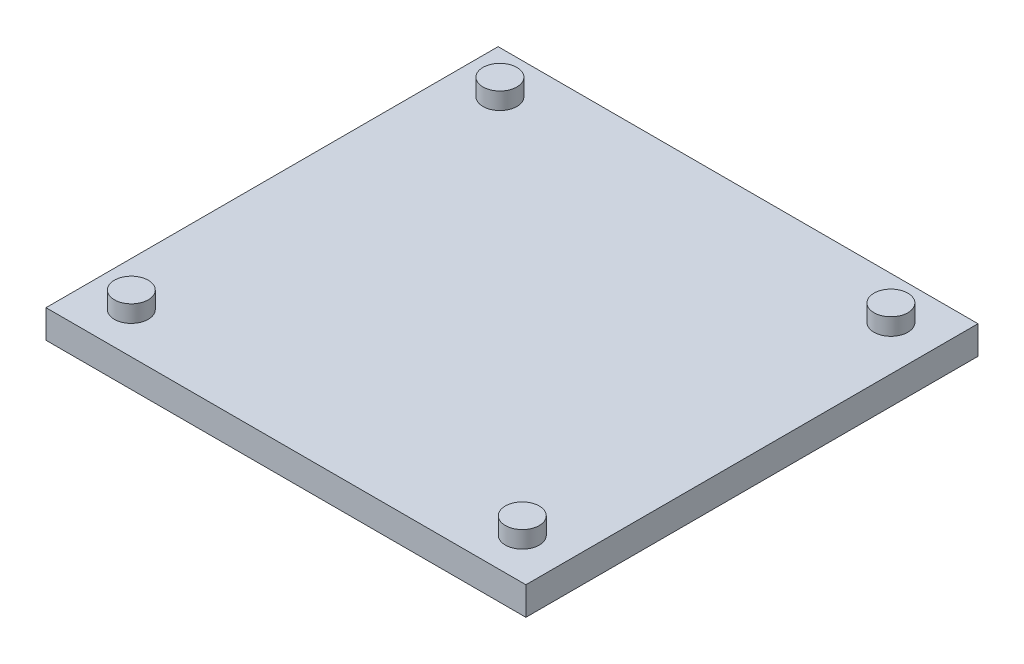
ISO-10303-21;
HEADER;
FILE_DESCRIPTION(('STEP AP214'),'2;1');
FILE_NAME('part.step','',(''),(''),'','','');
FILE_SCHEMA(('AUTOMOTIVE_DESIGN { 1 0 10303 214 1 1 1 1 }'));
ENDSEC;
DATA;
#1=APPLICATION_CONTEXT('core data for automotive mechanical design processes');
#2=APPLICATION_PROTOCOL_DEFINITION('international standard','automotive_design',2000,#1);
#3=PRODUCT_CONTEXT('',#1,'mechanical');
#4=PRODUCT('Part','Part','',(#3));
#5=PRODUCT_RELATED_PRODUCT_CATEGORY('part','',(#4));
#6=PRODUCT_DEFINITION_FORMATION('','',#4);
#7=PRODUCT_DEFINITION_CONTEXT('part definition',#1,'design');
#8=PRODUCT_DEFINITION('design','',#6,#7);
#9=PRODUCT_DEFINITION_SHAPE('','',#8);
#10=(LENGTH_UNIT() NAMED_UNIT(*) SI_UNIT(.MILLI.,.METRE.));
#11=(NAMED_UNIT(*) PLANE_ANGLE_UNIT() SI_UNIT($,.RADIAN.));
#12=(NAMED_UNIT(*) SI_UNIT($,.STERADIAN.) SOLID_ANGLE_UNIT());
#13=UNCERTAINTY_MEASURE_WITH_UNIT(LENGTH_MEASURE(1.E-05),#10,'distance_accuracy_value','');
#14=(GEOMETRIC_REPRESENTATION_CONTEXT(3) GLOBAL_UNCERTAINTY_ASSIGNED_CONTEXT((#13)) GLOBAL_UNIT_ASSIGNED_CONTEXT((#10,
#11,#12)) REPRESENTATION_CONTEXT('',''));
#15=CARTESIAN_POINT('',(0.,0.,0.));
#16=DIRECTION('',(0.,0.,1.));
#17=DIRECTION('',(1.,0.,0.));
#18=AXIS2_PLACEMENT_3D('',#15,#16,#17);
#19=CARTESIAN_POINT('',(0.,5.,0.));
#20=DIRECTION('',(0.,-1.,0.));
#21=DIRECTION('',(0.,0.,-1.));
#22=AXIS2_PLACEMENT_3D('',#19,#20,#21);
#23=PLANE('',#22);
#24=DIRECTION('',(-1.,0.,0.));
#25=VECTOR('',#24,1.);
#26=CARTESIAN_POINT('',(-44.4257114828403,5.,18.1171209400979));
#27=LINE('',#26,#25);
#28=CARTESIAN_POINT('',(40.4907436482127,5.,18.1171209400979));
#29=VERTEX_POINT('',#28);
#30=CARTESIAN_POINT('',(-44.4257114828403,5.,18.1171209400979));
#31=VERTEX_POINT('',#30);
#32=EDGE_CURVE('E91',#29,#31,#27,.T.);
#33=ORIENTED_EDGE('',*,*,#32,.T.);
#34=DIRECTION('',(0.,0.,1.));
#35=VECTOR('',#34,1.);
#36=CARTESIAN_POINT('',(-44.4257114828403,5.,18.1171209400979));
#37=LINE('',#36,#35);
#38=CARTESIAN_POINT('',(-44.4257114828403,5.,98.1171209400979));
#39=VERTEX_POINT('',#38);
#40=EDGE_CURVE('E86',#31,#39,#37,.T.);
#41=ORIENTED_EDGE('',*,*,#40,.T.);
#42=DIRECTION('',(1.,0.,0.));
#43=VECTOR('',#42,1.);
#44=CARTESIAN_POINT('',(-44.4257114828403,5.,98.1171209400979));
#45=LINE('',#44,#43);
#46=CARTESIAN_POINT('',(40.4907436482127,5.,98.1171209400979));
#47=VERTEX_POINT('',#46);
#48=EDGE_CURVE('E89',#39,#47,#45,.T.);
#49=ORIENTED_EDGE('',*,*,#48,.T.);
#50=DIRECTION('',(0.,0.,-1.));
#51=VECTOR('',#50,1.);
#52=CARTESIAN_POINT('',(40.4907436482127,5.,18.1171209400979));
#53=LINE('',#52,#51);
#54=EDGE_CURVE('E56',#47,#29,#53,.T.);
#55=ORIENTED_EDGE('',*,*,#54,.T.);
#56=EDGE_LOOP('',(#33,#41,#49,#55));
#57=FACE_BOUND('',#56,.T.);
#58=CARTESIAN_POINT('',(-36.5850717066579,5.,25.6363490732059));
#59=DIRECTION('',(0.,1.,0.));
#60=DIRECTION('',(0.,0.,1.));
#61=AXIS2_PLACEMENT_3D('',#58,#59,#60);
#62=CIRCLE('',#61,3.00000000000001);
#63=CARTESIAN_POINT('',(-36.5850717066579,5.,28.6363490732059));
#64=VERTEX_POINT('',#63);
#65=EDGE_CURVE('E106',#64,#64,#62,.T.);
#66=ORIENTED_EDGE('',*,*,#65,.F.);
#67=EDGE_LOOP('',(#66));
#68=FACE_BOUND('',#67,.T.);
#69=CARTESIAN_POINT('',(32.6016130829819,5.,25.6363490732059));
#70=DIRECTION('',(0.,1.,0.));
#71=DIRECTION('',(0.,0.,1.));
#72=AXIS2_PLACEMENT_3D('',#69,#70,#71);
#73=CIRCLE('',#72,3.);
#74=CARTESIAN_POINT('',(32.6016130829819,5.,28.6363490732059));
#75=VERTEX_POINT('',#74);
#76=EDGE_CURVE('E119',#75,#75,#73,.T.);
#77=ORIENTED_EDGE('',*,*,#76,.F.);
#78=EDGE_LOOP('',(#77));
#79=FACE_BOUND('',#78,.T.);
#80=CARTESIAN_POINT('',(-36.5850717066579,5.,90.8619641229808));
#81=DIRECTION('',(0.,1.,0.));
#82=DIRECTION('',(0.,0.,1.));
#83=AXIS2_PLACEMENT_3D('',#80,#81,#82);
#84=CIRCLE('',#83,3.00000000000001);
#85=CARTESIAN_POINT('',(-36.5850717066579,5.,93.8619641229808));
#86=VERTEX_POINT('',#85);
#87=EDGE_CURVE('E122',#86,#86,#84,.T.);
#88=ORIENTED_EDGE('',*,*,#87,.F.);
#89=EDGE_LOOP('',(#88));
#90=FACE_BOUND('',#89,.T.);
#91=CARTESIAN_POINT('',(32.6016130829819,5.,90.8619641229808));
#92=DIRECTION('',(0.,1.,0.));
#93=DIRECTION('',(0.,0.,1.));
#94=AXIS2_PLACEMENT_3D('',#91,#92,#93);
#95=CIRCLE('',#94,3.00000000000001);
#96=CARTESIAN_POINT('',(32.6016130829819,5.,93.8619641229808));
#97=VERTEX_POINT('',#96);
#98=EDGE_CURVE('E125',#97,#97,#95,.T.);
#99=ORIENTED_EDGE('',*,*,#98,.F.);
#100=EDGE_LOOP('',(#99));
#101=FACE_BOUND('',#100,.T.);
#102=ADVANCED_FACE('F39',(#57,#68,#79,#90,#101),#23,.F.);
#103=CARTESIAN_POINT('',(0.,0.,0.));
#104=DIRECTION('',(0.,-1.,0.));
#105=DIRECTION('',(0.,0.,-1.));
#106=AXIS2_PLACEMENT_3D('',#103,#104,#105);
#107=PLANE('',#106);
#108=DIRECTION('',(-1.,0.,0.));
#109=VECTOR('',#108,1.);
#110=CARTESIAN_POINT('',(-44.4257114828403,0.,18.1171209400979));
#111=LINE('',#110,#109);
#112=CARTESIAN_POINT('',(40.4907436482127,0.,18.1171209400979));
#113=VERTEX_POINT('',#112);
#114=CARTESIAN_POINT('',(-44.4257114828403,0.,18.1171209400979));
#115=VERTEX_POINT('',#114);
#116=EDGE_CURVE('E103',#113,#115,#111,.T.);
#117=ORIENTED_EDGE('',*,*,#116,.F.);
#118=DIRECTION('',(0.,0.,-1.));
#119=VECTOR('',#118,1.);
#120=CARTESIAN_POINT('',(40.4907436482127,0.,18.1171209400979));
#121=LINE('',#120,#119);
#122=CARTESIAN_POINT('',(40.4907436482127,0.,98.1171209400979));
#123=VERTEX_POINT('',#122);
#124=EDGE_CURVE('E79',#123,#113,#121,.T.);
#125=ORIENTED_EDGE('',*,*,#124,.F.);
#126=DIRECTION('',(1.,0.,0.));
#127=VECTOR('',#126,1.);
#128=CARTESIAN_POINT('',(-44.4257114828403,0.,98.1171209400979));
#129=LINE('',#128,#127);
#130=CARTESIAN_POINT('',(-44.4257114828403,0.,98.1171209400979));
#131=VERTEX_POINT('',#130);
#132=EDGE_CURVE('E73',#131,#123,#129,.T.);
#133=ORIENTED_EDGE('',*,*,#132,.F.);
#134=DIRECTION('',(0.,0.,1.));
#135=VECTOR('',#134,1.);
#136=CARTESIAN_POINT('',(-44.4257114828403,0.,18.1171209400979));
#137=LINE('',#136,#135);
#138=EDGE_CURVE('E95',#115,#131,#137,.T.);
#139=ORIENTED_EDGE('',*,*,#138,.F.);
#140=EDGE_LOOP('',(#117,#125,#133,#139));
#141=FACE_BOUND('',#140,.T.);
#142=ADVANCED_FACE('F114',(#141),#107,.T.);
#143=CARTESIAN_POINT('',(-44.4257114828403,5.,18.1171209400979));
#144=DIRECTION('',(0.,0.,1.));
#145=DIRECTION('',(1.,0.,0.));
#146=AXIS2_PLACEMENT_3D('',#143,#144,#145);
#147=PLANE('',#146);
#148=ORIENTED_EDGE('',*,*,#116,.T.);
#149=DIRECTION('',(0.,-1.,0.));
#150=VECTOR('',#149,1.);
#151=CARTESIAN_POINT('',(-44.4257114828403,5.,18.1171209400979));
#152=LINE('',#151,#150);
#153=EDGE_CURVE('E11',#31,#115,#152,.T.);
#154=ORIENTED_EDGE('',*,*,#153,.F.);
#155=ORIENTED_EDGE('',*,*,#32,.F.);
#156=DIRECTION('',(0.,-1.,0.));
#157=VECTOR('',#156,1.);
#158=CARTESIAN_POINT('',(40.4907436482127,5.,18.1171209400979));
#159=LINE('',#158,#157);
#160=EDGE_CURVE('E99',#29,#113,#159,.T.);
#161=ORIENTED_EDGE('',*,*,#160,.T.);
#162=EDGE_LOOP('',(#148,#154,#155,#161));
#163=FACE_BOUND('',#162,.T.);
#164=ADVANCED_FACE('F41',(#163),#147,.F.);
#165=CARTESIAN_POINT('',(-44.4257114828403,5.,18.1171209400979));
#166=DIRECTION('',(1.,0.,0.));
#167=DIRECTION('',(0.,0.,-1.));
#168=AXIS2_PLACEMENT_3D('',#165,#166,#167);
#169=PLANE('',#168);
#170=ORIENTED_EDGE('',*,*,#138,.T.);
#171=DIRECTION('',(0.,-1.,0.));
#172=VECTOR('',#171,1.);
#173=CARTESIAN_POINT('',(-44.4257114828403,5.,98.1171209400979));
#174=LINE('',#173,#172);
#175=EDGE_CURVE('E48',#39,#131,#174,.T.);
#176=ORIENTED_EDGE('',*,*,#175,.F.);
#177=ORIENTED_EDGE('',*,*,#40,.F.);
#178=ORIENTED_EDGE('',*,*,#153,.T.);
#179=EDGE_LOOP('',(#170,#176,#177,#178));
#180=FACE_BOUND('',#179,.T.);
#181=ADVANCED_FACE('F94',(#180),#169,.F.);
#182=CARTESIAN_POINT('',(-44.4257114828403,5.,98.1171209400979));
#183=DIRECTION('',(0.,0.,-1.));
#184=DIRECTION('',(-1.,0.,0.));
#185=AXIS2_PLACEMENT_3D('',#182,#183,#184);
#186=PLANE('',#185);
#187=ORIENTED_EDGE('',*,*,#132,.T.);
#188=DIRECTION('',(0.,-1.,0.));
#189=VECTOR('',#188,1.);
#190=CARTESIAN_POINT('',(40.4907436482127,5.,98.1171209400979));
#191=LINE('',#190,#189);
#192=EDGE_CURVE('E96',#47,#123,#191,.T.);
#193=ORIENTED_EDGE('',*,*,#192,.F.);
#194=ORIENTED_EDGE('',*,*,#48,.F.);
#195=ORIENTED_EDGE('',*,*,#175,.T.);
#196=EDGE_LOOP('',(#187,#193,#194,#195));
#197=FACE_BOUND('',#196,.T.);
#198=ADVANCED_FACE('F97',(#197),#186,.F.);
#199=CARTESIAN_POINT('',(40.4907436482127,5.,18.1171209400979));
#200=DIRECTION('',(-1.,0.,0.));
#201=DIRECTION('',(0.,0.,1.));
#202=AXIS2_PLACEMENT_3D('',#199,#200,#201);
#203=PLANE('',#202);
#204=ORIENTED_EDGE('',*,*,#124,.T.);
#205=ORIENTED_EDGE('',*,*,#160,.F.);
#206=ORIENTED_EDGE('',*,*,#54,.F.);
#207=ORIENTED_EDGE('',*,*,#192,.T.);
#208=EDGE_LOOP('',(#204,#205,#206,#207));
#209=FACE_BOUND('',#208,.T.);
#210=ADVANCED_FACE('F111',(#209),#203,.F.);
#211=CARTESIAN_POINT('',(-36.5850717066579,0.,25.6363490732059));
#212=DIRECTION('',(0.,1.,0.));
#213=DIRECTION('',(0.,0.,1.));
#214=AXIS2_PLACEMENT_3D('',#211,#212,#213);
#215=CYLINDRICAL_SURFACE('',#214,3.00000000000001);
#216=CARTESIAN_POINT('',(-36.5850717066579,8.,25.6363490732059));
#217=DIRECTION('',(0.,1.,0.));
#218=DIRECTION('',(0.,0.,1.));
#219=AXIS2_PLACEMENT_3D('',#216,#217,#218);
#220=CIRCLE('',#219,3.00000000000001);
#221=CARTESIAN_POINT('',(-36.5850717066579,8.,28.6363490732059));
#222=VERTEX_POINT('',#221);
#223=EDGE_CURVE('E128',#222,#222,#220,.T.);
#224=ORIENTED_EDGE('',*,*,#223,.F.);
#225=EDGE_LOOP('',(#224));
#226=FACE_BOUND('',#225,.T.);
#227=ORIENTED_EDGE('',*,*,#65,.T.);
#228=EDGE_LOOP('',(#227));
#229=FACE_BOUND('',#228,.T.);
#230=ADVANCED_FACE('F157',(#226,#229),#215,.T.);
#231=CARTESIAN_POINT('',(-36.5850717066579,8.,25.6363490732059));
#232=DIRECTION('',(0.,1.,0.));
#233=DIRECTION('',(0.,0.,1.));
#234=AXIS2_PLACEMENT_3D('',#231,#232,#233);
#235=PLANE('',#234);
#236=ORIENTED_EDGE('',*,*,#223,.T.);
#237=EDGE_LOOP('',(#236));
#238=FACE_BOUND('',#237,.T.);
#239=ADVANCED_FACE('F187',(#238),#235,.T.);
#240=CARTESIAN_POINT('',(32.6016130829819,0.,25.6363490732059));
#241=DIRECTION('',(0.,1.,0.));
#242=DIRECTION('',(0.,0.,1.));
#243=AXIS2_PLACEMENT_3D('',#240,#241,#242);
#244=CYLINDRICAL_SURFACE('',#243,3.);
#245=CARTESIAN_POINT('',(32.6016130829819,8.,25.6363490732059));
#246=DIRECTION('',(0.,1.,0.));
#247=DIRECTION('',(0.,0.,1.));
#248=AXIS2_PLACEMENT_3D('',#245,#246,#247);
#249=CIRCLE('',#248,3.);
#250=CARTESIAN_POINT('',(32.6016130829819,8.,28.6363490732059));
#251=VERTEX_POINT('',#250);
#252=EDGE_CURVE('E131',#251,#251,#249,.T.);
#253=ORIENTED_EDGE('',*,*,#252,.F.);
#254=EDGE_LOOP('',(#253));
#255=FACE_BOUND('',#254,.T.);
#256=ORIENTED_EDGE('',*,*,#76,.T.);
#257=EDGE_LOOP('',(#256));
#258=FACE_BOUND('',#257,.T.);
#259=ADVANCED_FACE('F197',(#255,#258),#244,.T.);
#260=CARTESIAN_POINT('',(32.6016130829819,8.,25.6363490732059));
#261=DIRECTION('',(0.,1.,0.));
#262=DIRECTION('',(0.,0.,1.));
#263=AXIS2_PLACEMENT_3D('',#260,#261,#262);
#264=PLANE('',#263);
#265=ORIENTED_EDGE('',*,*,#252,.T.);
#266=EDGE_LOOP('',(#265));
#267=FACE_BOUND('',#266,.T.);
#268=ADVANCED_FACE('F207',(#267),#264,.T.);
#269=CARTESIAN_POINT('',(-36.5850717066579,0.,90.8619641229808));
#270=DIRECTION('',(0.,1.,0.));
#271=DIRECTION('',(0.,0.,1.));
#272=AXIS2_PLACEMENT_3D('',#269,#270,#271);
#273=CYLINDRICAL_SURFACE('',#272,3.);
#274=CARTESIAN_POINT('',(-36.5850717066579,8.,90.8619641229808));
#275=DIRECTION('',(0.,1.,0.));
#276=DIRECTION('',(0.,0.,1.));
#277=AXIS2_PLACEMENT_3D('',#274,#275,#276);
#278=CIRCLE('',#277,3.);
#279=CARTESIAN_POINT('',(-36.5850717066579,8.,93.8619641229808));
#280=VERTEX_POINT('',#279);
#281=EDGE_CURVE('E134',#280,#280,#278,.T.);
#282=ORIENTED_EDGE('',*,*,#281,.F.);
#283=EDGE_LOOP('',(#282));
#284=FACE_BOUND('',#283,.T.);
#285=ORIENTED_EDGE('',*,*,#87,.T.);
#286=EDGE_LOOP('',(#285));
#287=FACE_BOUND('',#286,.T.);
#288=ADVANCED_FACE('F218',(#284,#287),#273,.T.);
#289=CARTESIAN_POINT('',(-36.5850717066579,8.,90.8619641229808));
#290=DIRECTION('',(0.,1.,0.));
#291=DIRECTION('',(0.,0.,1.));
#292=AXIS2_PLACEMENT_3D('',#289,#290,#291);
#293=PLANE('',#292);
#294=ORIENTED_EDGE('',*,*,#281,.T.);
#295=EDGE_LOOP('',(#294));
#296=FACE_BOUND('',#295,.T.);
#297=ADVANCED_FACE('F146',(#296),#293,.T.);
#298=CARTESIAN_POINT('',(32.6016130829819,0.,90.8619641229808));
#299=DIRECTION('',(0.,1.,0.));
#300=DIRECTION('',(0.,0.,1.));
#301=AXIS2_PLACEMENT_3D('',#298,#299,#300);
#302=CYLINDRICAL_SURFACE('',#301,3.);
#303=CARTESIAN_POINT('',(32.6016130829819,8.,90.8619641229808));
#304=DIRECTION('',(0.,1.,0.));
#305=DIRECTION('',(0.,0.,1.));
#306=AXIS2_PLACEMENT_3D('',#303,#304,#305);
#307=CIRCLE('',#306,3.);
#308=CARTESIAN_POINT('',(32.6016130829819,8.,93.8619641229808));
#309=VERTEX_POINT('',#308);
#310=EDGE_CURVE('E137',#309,#309,#307,.T.);
#311=ORIENTED_EDGE('',*,*,#310,.F.);
#312=EDGE_LOOP('',(#311));
#313=FACE_BOUND('',#312,.T.);
#314=ORIENTED_EDGE('',*,*,#98,.T.);
#315=EDGE_LOOP('',(#314));
#316=FACE_BOUND('',#315,.T.);
#317=ADVANCED_FACE('F143',(#313,#316),#302,.T.);
#318=CARTESIAN_POINT('',(32.6016130829819,8.,90.8619641229808));
#319=DIRECTION('',(0.,1.,0.));
#320=DIRECTION('',(0.,0.,1.));
#321=AXIS2_PLACEMENT_3D('',#318,#319,#320);
#322=PLANE('',#321);
#323=ORIENTED_EDGE('',*,*,#310,.T.);
#324=EDGE_LOOP('',(#323));
#325=FACE_BOUND('',#324,.T.);
#326=ADVANCED_FACE('F141',(#325),#322,.T.);
#327=CLOSED_SHELL('',(#102,#142,#164,#181,#198,#210,#230,#239,#259,#268,#288,#297,#317,#326));
#328=MANIFOLD_SOLID_BREP('B2',#327);
#329=ADVANCED_BREP_SHAPE_REPRESENTATION('',(#18,#328),#14);
#330=SHAPE_DEFINITION_REPRESENTATION(#9,#329);
ENDSEC;
END-ISO-10303-21;
